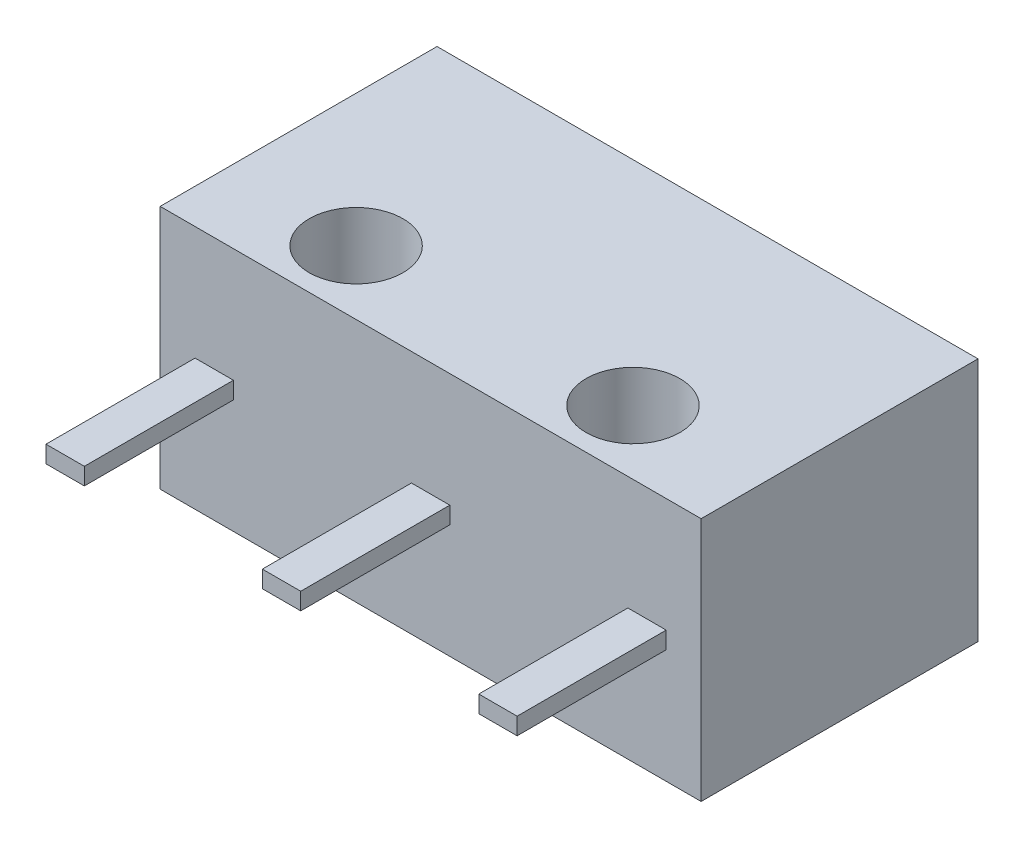
ISO-10303-21;
HEADER;
FILE_DESCRIPTION(('STEP AP214'),'2;1');
FILE_NAME('part.step','',(''),(''),'','','');
FILE_SCHEMA(('AUTOMOTIVE_DESIGN { 1 0 10303 214 1 1 1 1 }'));
ENDSEC;
DATA;
#1=APPLICATION_CONTEXT('core data for automotive mechanical design processes');
#2=APPLICATION_PROTOCOL_DEFINITION('international standard','automotive_design',2000,#1);
#3=PRODUCT_CONTEXT('',#1,'mechanical');
#4=PRODUCT('Part','Part','',(#3));
#5=PRODUCT_RELATED_PRODUCT_CATEGORY('part','',(#4));
#6=PRODUCT_DEFINITION_FORMATION('','',#4);
#7=PRODUCT_DEFINITION_CONTEXT('part definition',#1,'design');
#8=PRODUCT_DEFINITION('design','',#6,#7);
#9=PRODUCT_DEFINITION_SHAPE('','',#8);
#10=(LENGTH_UNIT() NAMED_UNIT(*) SI_UNIT(.MILLI.,.METRE.));
#11=(NAMED_UNIT(*) PLANE_ANGLE_UNIT() SI_UNIT($,.RADIAN.));
#12=(NAMED_UNIT(*) SI_UNIT($,.STERADIAN.) SOLID_ANGLE_UNIT());
#13=UNCERTAINTY_MEASURE_WITH_UNIT(LENGTH_MEASURE(1.E-05),#10,'distance_accuracy_value','');
#14=(GEOMETRIC_REPRESENTATION_CONTEXT(3) GLOBAL_UNCERTAINTY_ASSIGNED_CONTEXT((#13)) GLOBAL_UNIT_ASSIGNED_CONTEXT((#10,
#11,#12)) REPRESENTATION_CONTEXT('',''));
#15=CARTESIAN_POINT('',(0.,0.,0.));
#16=DIRECTION('',(0.,0.,1.));
#17=DIRECTION('',(1.,0.,0.));
#18=AXIS2_PLACEMENT_3D('',#15,#16,#17);
#19=CARTESIAN_POINT('',(0.,5.75,0.));
#20=DIRECTION('',(0.,0.,-1.));
#21=DIRECTION('',(-1.,0.,0.));
#22=AXIS2_PLACEMENT_3D('',#19,#20,#21);
#23=PLANE('',#22);
#24=DIRECTION('',(1.,0.,0.));
#25=VECTOR('',#24,1.);
#26=CARTESIAN_POINT('',(0.,0.,0.));
#27=LINE('',#26,#25);
#28=CARTESIAN_POINT('',(0.,0.,0.));
#29=VERTEX_POINT('',#28);
#30=CARTESIAN_POINT('',(12.7,0.,0.));
#31=VERTEX_POINT('',#30);
#32=EDGE_CURVE('E298',#29,#31,#27,.T.);
#33=ORIENTED_EDGE('',*,*,#32,.T.);
#34=DIRECTION('',(0.,-1.,0.));
#35=VECTOR('',#34,1.);
#36=CARTESIAN_POINT('',(12.7,5.75,0.));
#37=LINE('',#36,#35);
#38=CARTESIAN_POINT('',(12.7,5.75,0.));
#39=VERTEX_POINT('',#38);
#40=EDGE_CURVE('E45',#39,#31,#37,.T.);
#41=ORIENTED_EDGE('',*,*,#40,.F.);
#42=DIRECTION('',(1.,0.,0.));
#43=VECTOR('',#42,1.);
#44=CARTESIAN_POINT('',(0.,5.75,0.));
#45=LINE('',#44,#43);
#46=CARTESIAN_POINT('',(0.,5.75,0.));
#47=VERTEX_POINT('',#46);
#48=EDGE_CURVE('E288',#47,#39,#45,.T.);
#49=ORIENTED_EDGE('',*,*,#48,.F.);
#50=DIRECTION('',(0.,-1.,0.));
#51=VECTOR('',#50,1.);
#52=CARTESIAN_POINT('',(0.,5.75,0.));
#53=LINE('',#52,#51);
#54=EDGE_CURVE('E11',#47,#29,#53,.T.);
#55=ORIENTED_EDGE('',*,*,#54,.T.);
#56=EDGE_LOOP('',(#33,#41,#49,#55));
#57=FACE_BOUND('',#56,.T.);
#58=DIRECTION('',(0.,1.,0.));
#59=VECTOR('',#58,1.);
#60=CARTESIAN_POINT('',(6.8,2.675,0.));
#61=LINE('',#60,#59);
#62=CARTESIAN_POINT('',(6.8,2.675,0.));
#63=VERTEX_POINT('',#62);
#64=CARTESIAN_POINT('',(6.8,3.075,0.));
#65=VERTEX_POINT('',#64);
#66=EDGE_CURVE('E267',#63,#65,#61,.T.);
#67=ORIENTED_EDGE('',*,*,#66,.F.);
#68=DIRECTION('',(-1.,0.,0.));
#69=VECTOR('',#68,1.);
#70=CARTESIAN_POINT('',(5.9,2.675,0.));
#71=LINE('',#70,#69);
#72=CARTESIAN_POINT('',(5.9,2.675,0.));
#73=VERTEX_POINT('',#72);
#74=EDGE_CURVE('E261',#63,#73,#71,.T.);
#75=ORIENTED_EDGE('',*,*,#74,.T.);
#76=DIRECTION('',(0.,1.,0.));
#77=VECTOR('',#76,1.);
#78=CARTESIAN_POINT('',(5.9,2.675,0.));
#79=LINE('',#78,#77);
#80=CARTESIAN_POINT('',(5.9,3.075,0.));
#81=VERTEX_POINT('',#80);
#82=EDGE_CURVE('E264',#73,#81,#79,.T.);
#83=ORIENTED_EDGE('',*,*,#82,.T.);
#84=DIRECTION('',(-1.,0.,0.));
#85=VECTOR('',#84,1.);
#86=CARTESIAN_POINT('',(5.9,3.075,0.));
#87=LINE('',#86,#85);
#88=EDGE_CURVE('E249',#65,#81,#87,.T.);
#89=ORIENTED_EDGE('',*,*,#88,.F.);
#90=EDGE_LOOP('',(#67,#75,#83,#89));
#91=FACE_BOUND('',#90,.T.);
#92=DIRECTION('',(0.,1.,0.));
#93=VECTOR('',#92,1.);
#94=CARTESIAN_POINT('',(11.88,2.675,0.));
#95=LINE('',#94,#93);
#96=CARTESIAN_POINT('',(11.88,2.675,0.));
#97=VERTEX_POINT('',#96);
#98=CARTESIAN_POINT('',(11.88,3.075,0.));
#99=VERTEX_POINT('',#98);
#100=EDGE_CURVE('E237',#97,#99,#95,.T.);
#101=ORIENTED_EDGE('',*,*,#100,.F.);
#102=DIRECTION('',(-1.,0.,0.));
#103=VECTOR('',#102,1.);
#104=CARTESIAN_POINT('',(11.88,2.675,0.));
#105=LINE('',#104,#103);
#106=CARTESIAN_POINT('',(10.98,2.675,0.));
#107=VERTEX_POINT('',#106);
#108=EDGE_CURVE('E226',#97,#107,#105,.T.);
#109=ORIENTED_EDGE('',*,*,#108,.T.);
#110=DIRECTION('',(0.,1.,0.));
#111=VECTOR('',#110,1.);
#112=CARTESIAN_POINT('',(10.98,2.675,0.));
#113=LINE('',#112,#111);
#114=CARTESIAN_POINT('',(10.98,3.075,0.));
#115=VERTEX_POINT('',#114);
#116=EDGE_CURVE('E235',#107,#115,#113,.T.);
#117=ORIENTED_EDGE('',*,*,#116,.T.);
#118=DIRECTION('',(-1.,0.,0.));
#119=VECTOR('',#118,1.);
#120=CARTESIAN_POINT('',(11.88,3.075,0.));
#121=LINE('',#120,#119);
#122=EDGE_CURVE('E215',#99,#115,#121,.T.);
#123=ORIENTED_EDGE('',*,*,#122,.F.);
#124=EDGE_LOOP('',(#101,#109,#117,#123));
#125=FACE_BOUND('',#124,.T.);
#126=DIRECTION('',(-1.,0.,0.));
#127=VECTOR('',#126,1.);
#128=CARTESIAN_POINT('',(0.820000000000001,2.675,0.));
#129=LINE('',#128,#127);
#130=CARTESIAN_POINT('',(1.72,2.675,0.));
#131=VERTEX_POINT('',#130);
#132=CARTESIAN_POINT('',(0.820000000000001,2.675,0.));
#133=VERTEX_POINT('',#132);
#134=EDGE_CURVE('E196',#131,#133,#129,.T.);
#135=ORIENTED_EDGE('',*,*,#134,.T.);
#136=DIRECTION('',(0.,1.,0.));
#137=VECTOR('',#136,1.);
#138=CARTESIAN_POINT('',(0.820000000000001,2.675,0.));
#139=LINE('',#138,#137);
#140=CARTESIAN_POINT('',(0.820000000000001,3.075,0.));
#141=VERTEX_POINT('',#140);
#142=EDGE_CURVE('E200',#133,#141,#139,.T.);
#143=ORIENTED_EDGE('',*,*,#142,.T.);
#144=DIRECTION('',(-1.,0.,0.));
#145=VECTOR('',#144,1.);
#146=CARTESIAN_POINT('',(0.820000000000001,3.075,0.));
#147=LINE('',#146,#145);
#148=CARTESIAN_POINT('',(1.72,3.075,0.));
#149=VERTEX_POINT('',#148);
#150=EDGE_CURVE('E187',#149,#141,#147,.T.);
#151=ORIENTED_EDGE('',*,*,#150,.F.);
#152=DIRECTION('',(0.,1.,0.));
#153=VECTOR('',#152,1.);
#154=CARTESIAN_POINT('',(1.72,2.675,0.));
#155=LINE('',#154,#153);
#156=EDGE_CURVE('E204',#131,#149,#155,.T.);
#157=ORIENTED_EDGE('',*,*,#156,.F.);
#158=EDGE_LOOP('',(#135,#143,#151,#157));
#159=FACE_BOUND('',#158,.T.);
#160=ADVANCED_FACE('F37',(#57,#91,#125,#159),#23,.F.);
#161=CARTESIAN_POINT('',(0.,5.75,0.));
#162=DIRECTION('',(1.,0.,0.));
#163=DIRECTION('',(0.,0.,-1.));
#164=AXIS2_PLACEMENT_3D('',#161,#162,#163);
#165=PLANE('',#164);
#166=DIRECTION('',(0.,0.,1.));
#167=VECTOR('',#166,1.);
#168=CARTESIAN_POINT('',(0.,0.,0.));
#169=LINE('',#168,#167);
#170=CARTESIAN_POINT('',(0.,0.,-6.5));
#171=VERTEX_POINT('',#170);
#172=EDGE_CURVE('E276',#171,#29,#169,.T.);
#173=ORIENTED_EDGE('',*,*,#172,.T.);
#174=ORIENTED_EDGE('',*,*,#54,.F.);
#175=DIRECTION('',(0.,0.,1.));
#176=VECTOR('',#175,1.);
#177=CARTESIAN_POINT('',(0.,5.75,0.));
#178=LINE('',#177,#176);
#179=CARTESIAN_POINT('',(0.,5.75,-6.5));
#180=VERTEX_POINT('',#179);
#181=EDGE_CURVE('E285',#180,#47,#178,.T.);
#182=ORIENTED_EDGE('',*,*,#181,.F.);
#183=DIRECTION('',(0.,-1.,0.));
#184=VECTOR('',#183,1.);
#185=CARTESIAN_POINT('',(0.,5.75,-6.5));
#186=LINE('',#185,#184);
#187=EDGE_CURVE('E295',#180,#171,#186,.T.);
#188=ORIENTED_EDGE('',*,*,#187,.T.);
#189=EDGE_LOOP('',(#173,#174,#182,#188));
#190=FACE_BOUND('',#189,.T.);
#191=ADVANCED_FACE('F39',(#190),#165,.F.);
#192=CARTESIAN_POINT('',(12.7,5.75,0.));
#193=DIRECTION('',(-1.,0.,0.));
#194=DIRECTION('',(0.,0.,1.));
#195=AXIS2_PLACEMENT_3D('',#192,#193,#194);
#196=PLANE('',#195);
#197=DIRECTION('',(0.,0.,-1.));
#198=VECTOR('',#197,1.);
#199=CARTESIAN_POINT('',(12.7,0.,0.));
#200=LINE('',#199,#198);
#201=CARTESIAN_POINT('',(12.7,0.,-6.5));
#202=VERTEX_POINT('',#201);
#203=EDGE_CURVE('E300',#31,#202,#200,.T.);
#204=ORIENTED_EDGE('',*,*,#203,.T.);
#205=DIRECTION('',(0.,-1.,0.));
#206=VECTOR('',#205,1.);
#207=CARTESIAN_POINT('',(12.7,5.75,-6.5));
#208=LINE('',#207,#206);
#209=CARTESIAN_POINT('',(12.7,5.75,-6.5));
#210=VERTEX_POINT('',#209);
#211=EDGE_CURVE('E305',#210,#202,#208,.T.);
#212=ORIENTED_EDGE('',*,*,#211,.F.);
#213=DIRECTION('',(0.,0.,-1.));
#214=VECTOR('',#213,1.);
#215=CARTESIAN_POINT('',(12.7,5.75,0.));
#216=LINE('',#215,#214);
#217=EDGE_CURVE('E291',#39,#210,#216,.T.);
#218=ORIENTED_EDGE('',*,*,#217,.F.);
#219=ORIENTED_EDGE('',*,*,#40,.T.);
#220=EDGE_LOOP('',(#204,#212,#218,#219));
#221=FACE_BOUND('',#220,.T.);
#222=ADVANCED_FACE('F312',(#221),#196,.F.);
#223=CARTESIAN_POINT('',(0.,5.75,-6.5));
#224=DIRECTION('',(0.,0.,1.));
#225=DIRECTION('',(1.,0.,0.));
#226=AXIS2_PLACEMENT_3D('',#223,#224,#225);
#227=PLANE('',#226);
#228=DIRECTION('',(0.,1.,0.));
#229=VECTOR('',#228,1.);
#230=CARTESIAN_POINT('',(3.8,1.425,-6.5));
#231=LINE('',#230,#229);
#232=CARTESIAN_POINT('',(3.8,1.425,-6.5));
#233=VERTEX_POINT('',#232);
#234=CARTESIAN_POINT('',(3.8,4.325,-6.5));
#235=VERTEX_POINT('',#234);
#236=EDGE_CURVE('E57',#233,#235,#231,.T.);
#237=ORIENTED_EDGE('',*,*,#236,.F.);
#238=DIRECTION('',(1.,0.,0.));
#239=VECTOR('',#238,1.);
#240=CARTESIAN_POINT('',(3.8,1.425,-6.5));
#241=LINE('',#240,#239);
#242=CARTESIAN_POINT('',(5.,1.425,-6.5));
#243=VERTEX_POINT('',#242);
#244=EDGE_CURVE('E52',#233,#243,#241,.T.);
#245=ORIENTED_EDGE('',*,*,#244,.T.);
#246=DIRECTION('',(0.,1.,0.));
#247=VECTOR('',#246,1.);
#248=CARTESIAN_POINT('',(5.,1.425,-6.5));
#249=LINE('',#248,#247);
#250=CARTESIAN_POINT('',(5.,4.325,-6.5));
#251=VERTEX_POINT('',#250);
#252=EDGE_CURVE('E158',#243,#251,#249,.T.);
#253=ORIENTED_EDGE('',*,*,#252,.T.);
#254=DIRECTION('',(1.,0.,0.));
#255=VECTOR('',#254,1.);
#256=CARTESIAN_POINT('',(3.8,4.325,-6.5));
#257=LINE('',#256,#255);
#258=EDGE_CURVE('E162',#235,#251,#257,.T.);
#259=ORIENTED_EDGE('',*,*,#258,.F.);
#260=EDGE_LOOP('',(#237,#245,#253,#259));
#261=FACE_BOUND('',#260,.T.);
#262=DIRECTION('',(-1.,0.,0.));
#263=VECTOR('',#262,1.);
#264=CARTESIAN_POINT('',(0.,0.,-6.5));
#265=LINE('',#264,#263);
#266=EDGE_CURVE('E289',#202,#171,#265,.T.);
#267=ORIENTED_EDGE('',*,*,#266,.T.);
#268=ORIENTED_EDGE('',*,*,#187,.F.);
#269=DIRECTION('',(-1.,0.,0.));
#270=VECTOR('',#269,1.);
#271=CARTESIAN_POINT('',(0.,5.75,-6.5));
#272=LINE('',#271,#270);
#273=EDGE_CURVE('E293',#210,#180,#272,.T.);
#274=ORIENTED_EDGE('',*,*,#273,.F.);
#275=ORIENTED_EDGE('',*,*,#211,.T.);
#276=EDGE_LOOP('',(#267,#268,#274,#275));
#277=FACE_BOUND('',#276,.T.);
#278=ADVANCED_FACE('F160',(#261,#277),#227,.F.);
#279=CARTESIAN_POINT('',(0.,5.75,0.));
#280=DIRECTION('',(0.,-1.,0.));
#281=DIRECTION('',(0.,0.,-1.));
#282=AXIS2_PLACEMENT_3D('',#279,#280,#281);
#283=PLANE('',#282);
#284=CARTESIAN_POINT('',(3.1,5.75,-1.5));
#285=DIRECTION('',(0.,1.,0.));
#286=DIRECTION('',(0.,0.,1.));
#287=AXIS2_PLACEMENT_3D('',#284,#285,#286);
#288=CIRCLE('',#287,1.1);
#289=CARTESIAN_POINT('',(3.1,5.75,-0.4));
#290=VERTEX_POINT('',#289);
#291=EDGE_CURVE('E277',#290,#290,#288,.T.);
#292=ORIENTED_EDGE('',*,*,#291,.F.);
#293=EDGE_LOOP('',(#292));
#294=FACE_BOUND('',#293,.T.);
#295=CARTESIAN_POINT('',(9.6,5.75,-1.5));
#296=DIRECTION('',(0.,1.,0.));
#297=DIRECTION('',(0.,0.,1.));
#298=AXIS2_PLACEMENT_3D('',#295,#296,#297);
#299=CIRCLE('',#298,1.1);
#300=CARTESIAN_POINT('',(9.6,5.75,-0.4));
#301=VERTEX_POINT('',#300);
#302=EDGE_CURVE('E266',#301,#301,#299,.T.);
#303=ORIENTED_EDGE('',*,*,#302,.F.);
#304=EDGE_LOOP('',(#303));
#305=FACE_BOUND('',#304,.T.);
#306=ORIENTED_EDGE('',*,*,#181,.T.);
#307=ORIENTED_EDGE('',*,*,#48,.T.);
#308=ORIENTED_EDGE('',*,*,#217,.T.);
#309=ORIENTED_EDGE('',*,*,#273,.T.);
#310=EDGE_LOOP('',(#306,#307,#308,#309));
#311=FACE_BOUND('',#310,.T.);
#312=ADVANCED_FACE('F325',(#294,#305,#311),#283,.F.);
#313=CARTESIAN_POINT('',(0.,0.,0.));
#314=DIRECTION('',(0.,-1.,0.));
#315=DIRECTION('',(0.,0.,-1.));
#316=AXIS2_PLACEMENT_3D('',#313,#314,#315);
#317=PLANE('',#316);
#318=CARTESIAN_POINT('',(3.1,0.,-1.5));
#319=DIRECTION('',(0.,1.,0.));
#320=DIRECTION('',(0.,0.,1.));
#321=AXIS2_PLACEMENT_3D('',#318,#319,#320);
#322=CIRCLE('',#321,1.1);
#323=CARTESIAN_POINT('',(3.1,0.,-0.4));
#324=VERTEX_POINT('',#323);
#325=EDGE_CURVE('E273',#324,#324,#322,.T.);
#326=ORIENTED_EDGE('',*,*,#325,.T.);
#327=EDGE_LOOP('',(#326));
#328=FACE_BOUND('',#327,.T.);
#329=CARTESIAN_POINT('',(9.6,0.,-1.5));
#330=DIRECTION('',(0.,1.,0.));
#331=DIRECTION('',(0.,0.,1.));
#332=AXIS2_PLACEMENT_3D('',#329,#330,#331);
#333=CIRCLE('',#332,1.1);
#334=CARTESIAN_POINT('',(9.6,0.,-0.4));
#335=VERTEX_POINT('',#334);
#336=EDGE_CURVE('E280',#335,#335,#333,.T.);
#337=ORIENTED_EDGE('',*,*,#336,.T.);
#338=EDGE_LOOP('',(#337));
#339=FACE_BOUND('',#338,.T.);
#340=ORIENTED_EDGE('',*,*,#172,.F.);
#341=ORIENTED_EDGE('',*,*,#266,.F.);
#342=ORIENTED_EDGE('',*,*,#203,.F.);
#343=ORIENTED_EDGE('',*,*,#32,.F.);
#344=EDGE_LOOP('',(#340,#341,#342,#343));
#345=FACE_BOUND('',#344,.T.);
#346=ADVANCED_FACE('F318',(#328,#339,#345),#317,.T.);
#347=CARTESIAN_POINT('',(9.6,0.,-1.5));
#348=DIRECTION('',(0.,1.,0.));
#349=DIRECTION('',(0.,0.,1.));
#350=AXIS2_PLACEMENT_3D('',#347,#348,#349);
#351=CYLINDRICAL_SURFACE('',#350,1.1);
#352=ORIENTED_EDGE('',*,*,#336,.F.);
#353=EDGE_LOOP('',(#352));
#354=FACE_BOUND('',#353,.T.);
#355=ORIENTED_EDGE('',*,*,#302,.T.);
#356=EDGE_LOOP('',(#355));
#357=FACE_BOUND('',#356,.T.);
#358=ADVANCED_FACE('F405',(#354,#357),#351,.F.);
#359=CARTESIAN_POINT('',(3.1,0.,-1.5));
#360=DIRECTION('',(0.,1.,0.));
#361=DIRECTION('',(0.,0.,1.));
#362=AXIS2_PLACEMENT_3D('',#359,#360,#361);
#363=CYLINDRICAL_SURFACE('',#362,1.1);
#364=ORIENTED_EDGE('',*,*,#325,.F.);
#365=EDGE_LOOP('',(#364));
#366=FACE_BOUND('',#365,.T.);
#367=ORIENTED_EDGE('',*,*,#291,.T.);
#368=EDGE_LOOP('',(#367));
#369=FACE_BOUND('',#368,.T.);
#370=ADVANCED_FACE('F401',(#366,#369),#363,.F.);
#371=CARTESIAN_POINT('',(5.9,2.675,3.5));
#372=DIRECTION('',(-1.,0.,0.));
#373=DIRECTION('',(0.,0.,1.));
#374=AXIS2_PLACEMENT_3D('',#371,#372,#373);
#375=PLANE('',#374);
#376=DIRECTION('',(0.,1.,0.));
#377=VECTOR('',#376,1.);
#378=CARTESIAN_POINT('',(5.9,2.675,3.5));
#379=LINE('',#378,#377);
#380=CARTESIAN_POINT('',(5.9,2.675,3.5));
#381=VERTEX_POINT('',#380);
#382=CARTESIAN_POINT('',(5.9,3.075,3.5));
#383=VERTEX_POINT('',#382);
#384=EDGE_CURVE('E263',#381,#383,#379,.T.);
#385=ORIENTED_EDGE('',*,*,#384,.T.);
#386=DIRECTION('',(0.,0.,1.));
#387=VECTOR('',#386,1.);
#388=CARTESIAN_POINT('',(5.9,3.075,3.5));
#389=LINE('',#388,#387);
#390=EDGE_CURVE('E234',#81,#383,#389,.T.);
#391=ORIENTED_EDGE('',*,*,#390,.F.);
#392=ORIENTED_EDGE('',*,*,#82,.F.);
#393=DIRECTION('',(0.,0.,1.));
#394=VECTOR('',#393,1.);
#395=CARTESIAN_POINT('',(5.9,2.675,3.5));
#396=LINE('',#395,#394);
#397=EDGE_CURVE('E252',#73,#381,#396,.T.);
#398=ORIENTED_EDGE('',*,*,#397,.T.);
#399=EDGE_LOOP('',(#385,#391,#392,#398));
#400=FACE_BOUND('',#399,.T.);
#401=ADVANCED_FACE('F394',(#400),#375,.T.);
#402=CARTESIAN_POINT('',(6.8,2.675,3.5));
#403=DIRECTION('',(1.,0.,0.));
#404=DIRECTION('',(0.,0.,-1.));
#405=AXIS2_PLACEMENT_3D('',#402,#403,#404);
#406=PLANE('',#405);
#407=ORIENTED_EDGE('',*,*,#66,.T.);
#408=DIRECTION('',(0.,0.,-1.));
#409=VECTOR('',#408,1.);
#410=CARTESIAN_POINT('',(6.8,3.075,3.5));
#411=LINE('',#410,#409);
#412=CARTESIAN_POINT('',(6.8,3.075,3.5));
#413=VERTEX_POINT('',#412);
#414=EDGE_CURVE('E246',#413,#65,#411,.T.);
#415=ORIENTED_EDGE('',*,*,#414,.F.);
#416=DIRECTION('',(0.,1.,0.));
#417=VECTOR('',#416,1.);
#418=CARTESIAN_POINT('',(6.8,2.675,3.5));
#419=LINE('',#418,#417);
#420=CARTESIAN_POINT('',(6.8,2.675,3.5));
#421=VERTEX_POINT('',#420);
#422=EDGE_CURVE('E270',#421,#413,#419,.T.);
#423=ORIENTED_EDGE('',*,*,#422,.F.);
#424=DIRECTION('',(0.,0.,-1.));
#425=VECTOR('',#424,1.);
#426=CARTESIAN_POINT('',(6.8,2.675,3.5));
#427=LINE('',#426,#425);
#428=EDGE_CURVE('E258',#421,#63,#427,.T.);
#429=ORIENTED_EDGE('',*,*,#428,.T.);
#430=EDGE_LOOP('',(#407,#415,#423,#429));
#431=FACE_BOUND('',#430,.T.);
#432=ADVANCED_FACE('F391',(#431),#406,.T.);
#433=CARTESIAN_POINT('',(5.9,2.675,3.5));
#434=DIRECTION('',(0.,0.,1.));
#435=DIRECTION('',(1.,0.,0.));
#436=AXIS2_PLACEMENT_3D('',#433,#434,#435);
#437=PLANE('',#436);
#438=ORIENTED_EDGE('',*,*,#422,.T.);
#439=DIRECTION('',(1.,0.,0.));
#440=VECTOR('',#439,1.);
#441=CARTESIAN_POINT('',(5.9,3.075,3.5));
#442=LINE('',#441,#440);
#443=EDGE_CURVE('E243',#383,#413,#442,.T.);
#444=ORIENTED_EDGE('',*,*,#443,.F.);
#445=ORIENTED_EDGE('',*,*,#384,.F.);
#446=DIRECTION('',(1.,0.,0.));
#447=VECTOR('',#446,1.);
#448=CARTESIAN_POINT('',(5.9,2.675,3.5));
#449=LINE('',#448,#447);
#450=EDGE_CURVE('E255',#381,#421,#449,.T.);
#451=ORIENTED_EDGE('',*,*,#450,.T.);
#452=EDGE_LOOP('',(#438,#444,#445,#451));
#453=FACE_BOUND('',#452,.T.);
#454=ADVANCED_FACE('F389',(#453),#437,.T.);
#455=CARTESIAN_POINT('',(0.,2.675,0.));
#456=DIRECTION('',(0.,-1.,0.));
#457=DIRECTION('',(0.,0.,-1.));
#458=AXIS2_PLACEMENT_3D('',#455,#456,#457);
#459=PLANE('',#458);
#460=ORIENTED_EDGE('',*,*,#397,.F.);
#461=ORIENTED_EDGE('',*,*,#74,.F.);
#462=ORIENTED_EDGE('',*,*,#428,.F.);
#463=ORIENTED_EDGE('',*,*,#450,.F.);
#464=EDGE_LOOP('',(#460,#461,#462,#463));
#465=FACE_BOUND('',#464,.T.);
#466=ADVANCED_FACE('F385',(#465),#459,.T.);
#467=CARTESIAN_POINT('',(0.,3.075,0.));
#468=DIRECTION('',(0.,-1.,0.));
#469=DIRECTION('',(0.,0.,-1.));
#470=AXIS2_PLACEMENT_3D('',#467,#468,#469);
#471=PLANE('',#470);
#472=ORIENTED_EDGE('',*,*,#390,.T.);
#473=ORIENTED_EDGE('',*,*,#443,.T.);
#474=ORIENTED_EDGE('',*,*,#414,.T.);
#475=ORIENTED_EDGE('',*,*,#88,.T.);
#476=EDGE_LOOP('',(#472,#473,#474,#475));
#477=FACE_BOUND('',#476,.T.);
#478=ADVANCED_FACE('F375',(#477),#471,.F.);
#479=CARTESIAN_POINT('',(10.98,2.675,3.5));
#480=DIRECTION('',(-1.,0.,0.));
#481=DIRECTION('',(0.,0.,1.));
#482=AXIS2_PLACEMENT_3D('',#479,#480,#481);
#483=PLANE('',#482);
#484=DIRECTION('',(0.,1.,0.));
#485=VECTOR('',#484,1.);
#486=CARTESIAN_POINT('',(10.98,2.675,3.5));
#487=LINE('',#486,#485);
#488=CARTESIAN_POINT('',(10.98,2.675,3.5));
#489=VERTEX_POINT('',#488);
#490=CARTESIAN_POINT('',(10.98,3.075,3.5));
#491=VERTEX_POINT('',#490);
#492=EDGE_CURVE('E232',#489,#491,#487,.T.);
#493=ORIENTED_EDGE('',*,*,#492,.T.);
#494=DIRECTION('',(0.,0.,1.));
#495=VECTOR('',#494,1.);
#496=CARTESIAN_POINT('',(10.98,3.075,3.5));
#497=LINE('',#496,#495);
#498=EDGE_CURVE('E218',#115,#491,#497,.T.);
#499=ORIENTED_EDGE('',*,*,#498,.F.);
#500=ORIENTED_EDGE('',*,*,#116,.F.);
#501=DIRECTION('',(0.,0.,1.));
#502=VECTOR('',#501,1.);
#503=CARTESIAN_POINT('',(10.98,2.675,3.5));
#504=LINE('',#503,#502);
#505=EDGE_CURVE('E228',#107,#489,#504,.T.);
#506=ORIENTED_EDGE('',*,*,#505,.T.);
#507=EDGE_LOOP('',(#493,#499,#500,#506));
#508=FACE_BOUND('',#507,.T.);
#509=ADVANCED_FACE('F371',(#508),#483,.T.);
#510=CARTESIAN_POINT('',(11.88,2.675,0.));
#511=DIRECTION('',(1.,0.,0.));
#512=DIRECTION('',(0.,0.,-1.));
#513=AXIS2_PLACEMENT_3D('',#510,#511,#512);
#514=PLANE('',#513);
#515=ORIENTED_EDGE('',*,*,#100,.T.);
#516=DIRECTION('',(0.,0.,-1.));
#517=VECTOR('',#516,1.);
#518=CARTESIAN_POINT('',(11.88,3.075,0.));
#519=LINE('',#518,#517);
#520=CARTESIAN_POINT('',(11.88,3.075,3.5));
#521=VERTEX_POINT('',#520);
#522=EDGE_CURVE('E212',#521,#99,#519,.T.);
#523=ORIENTED_EDGE('',*,*,#522,.F.);
#524=DIRECTION('',(0.,1.,0.));
#525=VECTOR('',#524,1.);
#526=CARTESIAN_POINT('',(11.88,2.675,3.5));
#527=LINE('',#526,#525);
#528=CARTESIAN_POINT('',(11.88,2.675,3.5));
#529=VERTEX_POINT('',#528);
#530=EDGE_CURVE('E231',#529,#521,#527,.T.);
#531=ORIENTED_EDGE('',*,*,#530,.F.);
#532=DIRECTION('',(0.,0.,-1.));
#533=VECTOR('',#532,1.);
#534=CARTESIAN_POINT('',(11.88,2.675,0.));
#535=LINE('',#534,#533);
#536=EDGE_CURVE('E223',#529,#97,#535,.T.);
#537=ORIENTED_EDGE('',*,*,#536,.T.);
#538=EDGE_LOOP('',(#515,#523,#531,#537));
#539=FACE_BOUND('',#538,.T.);
#540=ADVANCED_FACE('F374',(#539),#514,.T.);
#541=CARTESIAN_POINT('',(11.88,2.675,3.5));
#542=DIRECTION('',(0.,0.,1.));
#543=DIRECTION('',(1.,0.,0.));
#544=AXIS2_PLACEMENT_3D('',#541,#542,#543);
#545=PLANE('',#544);
#546=ORIENTED_EDGE('',*,*,#530,.T.);
#547=DIRECTION('',(1.,0.,0.));
#548=VECTOR('',#547,1.);
#549=CARTESIAN_POINT('',(11.43,3.075,3.5));
#550=LINE('',#549,#548);
#551=EDGE_CURVE('E203',#491,#521,#550,.T.);
#552=ORIENTED_EDGE('',*,*,#551,.F.);
#553=ORIENTED_EDGE('',*,*,#492,.F.);
#554=DIRECTION('',(1.,0.,0.));
#555=VECTOR('',#554,1.);
#556=CARTESIAN_POINT('',(11.43,2.675,3.5));
#557=LINE('',#556,#555);
#558=EDGE_CURVE('E221',#489,#529,#557,.T.);
#559=ORIENTED_EDGE('',*,*,#558,.T.);
#560=EDGE_LOOP('',(#546,#552,#553,#559));
#561=FACE_BOUND('',#560,.T.);
#562=ADVANCED_FACE('F369',(#561),#545,.T.);
#563=CARTESIAN_POINT('',(0.,2.675,0.));
#564=DIRECTION('',(0.,-1.,0.));
#565=DIRECTION('',(0.,0.,-1.));
#566=AXIS2_PLACEMENT_3D('',#563,#564,#565);
#567=PLANE('',#566);
#568=ORIENTED_EDGE('',*,*,#558,.F.);
#569=ORIENTED_EDGE('',*,*,#505,.F.);
#570=ORIENTED_EDGE('',*,*,#108,.F.);
#571=ORIENTED_EDGE('',*,*,#536,.F.);
#572=EDGE_LOOP('',(#568,#569,#570,#571));
#573=FACE_BOUND('',#572,.T.);
#574=ADVANCED_FACE('F365',(#573),#567,.T.);
#575=CARTESIAN_POINT('',(0.,3.075,0.));
#576=DIRECTION('',(0.,-1.,0.));
#577=DIRECTION('',(0.,0.,-1.));
#578=AXIS2_PLACEMENT_3D('',#575,#576,#577);
#579=PLANE('',#578);
#580=ORIENTED_EDGE('',*,*,#551,.T.);
#581=ORIENTED_EDGE('',*,*,#522,.T.);
#582=ORIENTED_EDGE('',*,*,#122,.T.);
#583=ORIENTED_EDGE('',*,*,#498,.T.);
#584=EDGE_LOOP('',(#580,#581,#582,#583));
#585=FACE_BOUND('',#584,.T.);
#586=ADVANCED_FACE('F362',(#585),#579,.F.);
#587=CARTESIAN_POINT('',(0.820000000000001,2.675,0.));
#588=DIRECTION('',(-1.,0.,0.));
#589=DIRECTION('',(0.,0.,1.));
#590=AXIS2_PLACEMENT_3D('',#587,#588,#589);
#591=PLANE('',#590);
#592=DIRECTION('',(0.,1.,0.));
#593=VECTOR('',#592,1.);
#594=CARTESIAN_POINT('',(0.820000000000001,2.675,3.5));
#595=LINE('',#594,#593);
#596=CARTESIAN_POINT('',(0.820000000000001,2.675,3.5));
#597=VERTEX_POINT('',#596);
#598=CARTESIAN_POINT('',(0.820000000000001,3.075,3.5));
#599=VERTEX_POINT('',#598);
#600=EDGE_CURVE('E199',#597,#599,#595,.T.);
#601=ORIENTED_EDGE('',*,*,#600,.T.);
#602=DIRECTION('',(0.,0.,1.));
#603=VECTOR('',#602,1.);
#604=CARTESIAN_POINT('',(0.820000000000001,3.075,0.));
#605=LINE('',#604,#603);
#606=EDGE_CURVE('E166',#141,#599,#605,.T.);
#607=ORIENTED_EDGE('',*,*,#606,.F.);
#608=ORIENTED_EDGE('',*,*,#142,.F.);
#609=DIRECTION('',(0.,0.,1.));
#610=VECTOR('',#609,1.);
#611=CARTESIAN_POINT('',(0.820000000000001,2.675,0.));
#612=LINE('',#611,#610);
#613=EDGE_CURVE('E189',#133,#597,#612,.T.);
#614=ORIENTED_EDGE('',*,*,#613,.T.);
#615=EDGE_LOOP('',(#601,#607,#608,#614));
#616=FACE_BOUND('',#615,.T.);
#617=ADVANCED_FACE('F340',(#616),#591,.T.);
#618=CARTESIAN_POINT('',(1.72,2.675,3.5));
#619=DIRECTION('',(1.,0.,0.));
#620=DIRECTION('',(0.,0.,-1.));
#621=AXIS2_PLACEMENT_3D('',#618,#619,#620);
#622=PLANE('',#621);
#623=ORIENTED_EDGE('',*,*,#156,.T.);
#624=DIRECTION('',(0.,0.,-1.));
#625=VECTOR('',#624,1.);
#626=CARTESIAN_POINT('',(1.72,3.075,3.5));
#627=LINE('',#626,#625);
#628=CARTESIAN_POINT('',(1.72,3.075,3.5));
#629=VERTEX_POINT('',#628);
#630=EDGE_CURVE('E185',#629,#149,#627,.T.);
#631=ORIENTED_EDGE('',*,*,#630,.F.);
#632=DIRECTION('',(0.,1.,0.));
#633=VECTOR('',#632,1.);
#634=CARTESIAN_POINT('',(1.72,2.675,3.5));
#635=LINE('',#634,#633);
#636=CARTESIAN_POINT('',(1.72,2.675,3.5));
#637=VERTEX_POINT('',#636);
#638=EDGE_CURVE('E207',#637,#629,#635,.T.);
#639=ORIENTED_EDGE('',*,*,#638,.F.);
#640=DIRECTION('',(0.,0.,-1.));
#641=VECTOR('',#640,1.);
#642=CARTESIAN_POINT('',(1.72,2.675,3.5));
#643=LINE('',#642,#641);
#644=EDGE_CURVE('E194',#637,#131,#643,.T.);
#645=ORIENTED_EDGE('',*,*,#644,.T.);
#646=EDGE_LOOP('',(#623,#631,#639,#645));
#647=FACE_BOUND('',#646,.T.);
#648=ADVANCED_FACE('F348',(#647),#622,.T.);
#649=CARTESIAN_POINT('',(1.27,2.675,3.5));
#650=DIRECTION('',(0.,0.,1.));
#651=DIRECTION('',(1.,0.,0.));
#652=AXIS2_PLACEMENT_3D('',#649,#650,#651);
#653=PLANE('',#652);
#654=ORIENTED_EDGE('',*,*,#638,.T.);
#655=DIRECTION('',(1.,0.,0.));
#656=VECTOR('',#655,1.);
#657=CARTESIAN_POINT('',(0.820000000000001,3.075,3.5));
#658=LINE('',#657,#656);
#659=EDGE_CURVE('E182',#599,#629,#658,.T.);
#660=ORIENTED_EDGE('',*,*,#659,.F.);
#661=ORIENTED_EDGE('',*,*,#600,.F.);
#662=DIRECTION('',(1.,0.,0.));
#663=VECTOR('',#662,1.);
#664=CARTESIAN_POINT('',(0.820000000000001,2.675,3.5));
#665=LINE('',#664,#663);
#666=EDGE_CURVE('E192',#597,#637,#665,.T.);
#667=ORIENTED_EDGE('',*,*,#666,.T.);
#668=EDGE_LOOP('',(#654,#660,#661,#667));
#669=FACE_BOUND('',#668,.T.);
#670=ADVANCED_FACE('F350',(#669),#653,.T.);
#671=CARTESIAN_POINT('',(0.,2.675,0.));
#672=DIRECTION('',(0.,1.,0.));
#673=DIRECTION('',(0.,0.,1.));
#674=AXIS2_PLACEMENT_3D('',#671,#672,#673);
#675=PLANE('',#674);
#676=ORIENTED_EDGE('',*,*,#613,.F.);
#677=ORIENTED_EDGE('',*,*,#134,.F.);
#678=ORIENTED_EDGE('',*,*,#644,.F.);
#679=ORIENTED_EDGE('',*,*,#666,.F.);
#680=EDGE_LOOP('',(#676,#677,#678,#679));
#681=FACE_BOUND('',#680,.T.);
#682=ADVANCED_FACE('F337',(#681),#675,.F.);
#683=CARTESIAN_POINT('',(0.,3.075,0.));
#684=DIRECTION('',(0.,1.,0.));
#685=DIRECTION('',(0.,0.,1.));
#686=AXIS2_PLACEMENT_3D('',#683,#684,#685);
#687=PLANE('',#686);
#688=ORIENTED_EDGE('',*,*,#606,.T.);
#689=ORIENTED_EDGE('',*,*,#659,.T.);
#690=ORIENTED_EDGE('',*,*,#630,.T.);
#691=ORIENTED_EDGE('',*,*,#150,.T.);
#692=EDGE_LOOP('',(#688,#689,#690,#691));
#693=FACE_BOUND('',#692,.T.);
#694=ADVANCED_FACE('F344',(#693),#687,.T.);
#695=CARTESIAN_POINT('',(4.4,1.425,-6.5));
#696=DIRECTION('',(0.,1.,0.));
#697=DIRECTION('',(0.,0.,1.));
#698=AXIS2_PLACEMENT_3D('',#695,#696,#697);
#699=CYLINDRICAL_SURFACE('',#698,0.6);
#700=ORIENTED_EDGE('',*,*,#236,.T.);
#701=CARTESIAN_POINT('',(4.4,4.325,-6.5));
#702=DIRECTION('',(0.,1.,0.));
#703=DIRECTION('',(0.,0.,-1.));
#704=AXIS2_PLACEMENT_3D('',#701,#702,#703);
#705=CIRCLE('',#704,0.6);
#706=EDGE_CURVE('E171',#251,#235,#705,.T.);
#707=ORIENTED_EDGE('',*,*,#706,.F.);
#708=ORIENTED_EDGE('',*,*,#252,.F.);
#709=CARTESIAN_POINT('',(4.4,1.425,-6.5));
#710=DIRECTION('',(0.,1.,0.));
#711=DIRECTION('',(0.,0.,-1.));
#712=AXIS2_PLACEMENT_3D('',#709,#710,#711);
#713=CIRCLE('',#712,0.6);
#714=EDGE_CURVE('E172',#243,#233,#713,.T.);
#715=ORIENTED_EDGE('',*,*,#714,.T.);
#716=EDGE_LOOP('',(#700,#707,#708,#715));
#717=FACE_BOUND('',#716,.T.);
#718=ADVANCED_FACE('F174',(#717),#699,.T.);
#719=CARTESIAN_POINT('',(4.4,1.425,-6.5));
#720=DIRECTION('',(0.,-1.,0.));
#721=DIRECTION('',(0.,0.,-1.));
#722=AXIS2_PLACEMENT_3D('',#719,#720,#721);
#723=PLANE('',#722);
#724=ORIENTED_EDGE('',*,*,#714,.F.);
#725=ORIENTED_EDGE('',*,*,#244,.F.);
#726=EDGE_LOOP('',(#724,#725));
#727=FACE_BOUND('',#726,.T.);
#728=ADVANCED_FACE('F523',(#727),#723,.T.);
#729=CARTESIAN_POINT('',(4.4,4.325,-6.5));
#730=DIRECTION('',(0.,-1.,0.));
#731=DIRECTION('',(0.,0.,-1.));
#732=AXIS2_PLACEMENT_3D('',#729,#730,#731);
#733=PLANE('',#732);
#734=ORIENTED_EDGE('',*,*,#706,.T.);
#735=ORIENTED_EDGE('',*,*,#258,.T.);
#736=EDGE_LOOP('',(#734,#735));
#737=FACE_BOUND('',#736,.T.);
#738=ADVANCED_FACE('F170',(#737),#733,.F.);
#739=CLOSED_SHELL('',(#160,#191,#222,#278,#312,#346,#358,#370,#401,#432,#454,#466,#478,#509,
#540,#562,#574,#586,#617,#648,#670,#682,#694,#718,#728,#738));
#740=MANIFOLD_SOLID_BREP('B2',#739);
#741=ADVANCED_BREP_SHAPE_REPRESENTATION('',(#18,#740),#14);
#742=SHAPE_DEFINITION_REPRESENTATION(#9,#741);
ENDSEC;
END-ISO-10303-21;
